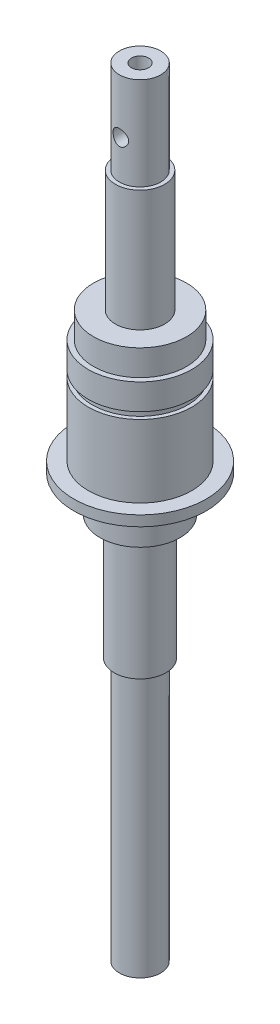
ISO-10303-21;
HEADER;
FILE_DESCRIPTION(('STEP AP214'),'2;1');
FILE_NAME('part.step','',(''),(''),'','','');
FILE_SCHEMA(('AUTOMOTIVE_DESIGN { 1 0 10303 214 1 1 1 1 }'));
ENDSEC;
DATA;
#1=APPLICATION_CONTEXT('core data for automotive mechanical design processes');
#2=APPLICATION_PROTOCOL_DEFINITION('international standard','automotive_design',2000,#1);
#3=PRODUCT_CONTEXT('',#1,'mechanical');
#4=PRODUCT('Part','Part','',(#3));
#5=PRODUCT_RELATED_PRODUCT_CATEGORY('part','',(#4));
#6=PRODUCT_DEFINITION_FORMATION('','',#4);
#7=PRODUCT_DEFINITION_CONTEXT('part definition',#1,'design');
#8=PRODUCT_DEFINITION('design','',#6,#7);
#9=PRODUCT_DEFINITION_SHAPE('','',#8);
#10=(LENGTH_UNIT() NAMED_UNIT(*) SI_UNIT(.MILLI.,.METRE.));
#11=(NAMED_UNIT(*) PLANE_ANGLE_UNIT() SI_UNIT($,.RADIAN.));
#12=(NAMED_UNIT(*) SI_UNIT($,.STERADIAN.) SOLID_ANGLE_UNIT());
#13=UNCERTAINTY_MEASURE_WITH_UNIT(LENGTH_MEASURE(1.E-05),#10,'distance_accuracy_value','');
#14=(GEOMETRIC_REPRESENTATION_CONTEXT(3) GLOBAL_UNCERTAINTY_ASSIGNED_CONTEXT((#13)) GLOBAL_UNIT_ASSIGNED_CONTEXT((#10,
#11,#12)) REPRESENTATION_CONTEXT('',''));
#15=CARTESIAN_POINT('',(0.,0.,0.));
#16=DIRECTION('',(0.,0.,1.));
#17=DIRECTION('',(1.,0.,0.));
#18=AXIS2_PLACEMENT_3D('',#15,#16,#17);
#19=CARTESIAN_POINT('',(0.,110.990908366985,0.));
#20=DIRECTION('',(0.,-1.,0.));
#21=DIRECTION('',(0.,0.,-1.));
#22=AXIS2_PLACEMENT_3D('',#19,#20,#21);
#23=CYLINDRICAL_SURFACE('',#22,4.);
#24=CARTESIAN_POINT('',(0.,90.67720004,-4.));
#25=CARTESIAN_POINT('',(0.0812350589378534,90.6772029423031,-4.00000217456151));
#26=CARTESIAN_POINT('',(0.162450241781793,90.6705802797516,-3.99750379283184));
#27=CARTESIAN_POINT('',(0.322453452352362,90.64437184473,-3.98778696006928));
#28=CARTESIAN_POINT('',(0.401241827987616,90.6247879395294,-3.98056918893993));
#29=CARTESIAN_POINT('',(0.55406078499088,90.5734470382282,-3.96218832391545));
#30=CARTESIAN_POINT('',(0.628100224162279,90.5417135231782,-3.9510328434944));
#31=CARTESIAN_POINT('',(0.769799310160251,90.4670936269842,-3.92588767765353));
#32=CARTESIAN_POINT('',(0.837457239177873,90.4242042544558,-3.91189723227548));
#33=CARTESIAN_POINT('',(0.96734641704582,90.3265875089291,-3.88186246971216));
#34=CARTESIAN_POINT('',(1.02927073015119,90.2714697777406,-3.86576002583566));
#35=CARTESIAN_POINT('',(1.14324421474363,90.1517896053411,-3.83360220871327));
#36=CARTESIAN_POINT('',(1.19529036359202,90.0872242839121,-3.81754685135034));
#37=CARTESIAN_POINT('',(1.28998202215984,89.9474825724768,-3.78662470617732));
#38=CARTESIAN_POINT('',(1.33219393195759,89.8719956734542,-3.77182648820819));
#39=CARTESIAN_POINT('',(1.40318646334084,89.7143516858315,-3.74599860237433));
#40=CARTESIAN_POINT('',(1.43197244961239,89.6321972768449,-3.73496742975881));
#41=CARTESIAN_POINT('',(1.47408431017549,89.4670832997418,-3.71854412824136));
#42=CARTESIAN_POINT('',(1.48799593218557,89.3842950015646,-3.71293924350838));
#43=CARTESIAN_POINT('',(1.50179556531648,89.2173838820061,-3.70738061461215));
#44=CARTESIAN_POINT('',(1.5016893680263,89.1332616261255,-3.70742453659305));
#45=CARTESIAN_POINT('',(1.48790429610018,88.971430514787,-3.71297511632055));
#46=CARTESIAN_POINT('',(1.47503808509003,88.8936391339558,-3.71815468871122));
#47=CARTESIAN_POINT('',(1.4374416786833,88.7414128895947,-3.7328493805953));
#48=CARTESIAN_POINT('',(1.41270969663258,88.6669785333861,-3.74236515298863));
#49=CARTESIAN_POINT('',(1.35163748571904,88.5219229722718,-3.76485702190253));
#50=CARTESIAN_POINT('',(1.315086487371,88.4514005538787,-3.77789517988166));
#51=CARTESIAN_POINT('',(1.23156073762698,88.317254302409,-3.80594210139319));
#52=CARTESIAN_POINT('',(1.18458238728897,88.2536328624803,-3.82095154457158));
#53=CARTESIAN_POINT('',(1.07781780766549,88.1305963763491,-3.85248038859114));
#54=CARTESIAN_POINT('',(1.01738298716956,88.0717513992519,-3.86903347455671));
#55=CARTESIAN_POINT('',(0.887312590819024,87.9648620737942,-3.90091728164085));
#56=CARTESIAN_POINT('',(0.817675603497369,87.9168193853943,-3.91624781465951));
#57=CARTESIAN_POINT('',(0.669723436992427,87.8322696429375,-3.94426394809079));
#58=CARTESIAN_POINT('',(0.591290713844726,87.7959524587789,-3.95690498259616));
#59=CARTESIAN_POINT('',(0.428836850524589,87.73721743573,-3.97778718326962));
#60=CARTESIAN_POINT('',(0.344818210845773,87.7147934234389,-3.98603030341494));
#61=CARTESIAN_POINT('',(0.178375243148671,87.6855772524581,-3.99684443228066));
#62=CARTESIAN_POINT('',(0.0961036195622165,87.6780174336175,-3.99969369025687));
#63=CARTESIAN_POINT('',(-0.0685724752550155,87.6765089761001,-4.00025893700125));
#64=CARTESIAN_POINT('',(-0.150976912983363,87.6825573196832,-3.99797606386863));
#65=CARTESIAN_POINT('',(-0.310262048561848,87.7075100823087,-3.98871709772643));
#66=CARTESIAN_POINT('',(-0.387233328007324,87.7259115837371,-3.98192470962305));
#67=CARTESIAN_POINT('',(-0.536941754957206,87.7743861125473,-3.96451477091717));
#68=CARTESIAN_POINT('',(-0.609678350347519,87.804460657948,-3.9538967228203));
#69=CARTESIAN_POINT('',(-0.751247765110141,87.8763864524395,-3.92949624407681));
#70=CARTESIAN_POINT('',(-0.819903083557782,87.9185577692234,-3.91563000209349));
#71=CARTESIAN_POINT('',(-0.949392711726614,88.0131181431715,-3.88626671564664));
#72=CARTESIAN_POINT('',(-1.01022412027044,88.0655109725451,-3.87076907009516));
#73=CARTESIAN_POINT('',(-1.12603079874453,88.1826041621242,-3.83873329490989));
#74=CARTESIAN_POINT('',(-1.18046154123567,88.2478422227727,-3.8221869650373));
#75=CARTESIAN_POINT('',(-1.27771050031901,88.3868514247076,-3.79078815746855));
#76=CARTESIAN_POINT('',(-1.32052767414516,88.4606233313885,-3.775935831944));
#77=CARTESIAN_POINT('',(-1.39337773518996,88.6152160267723,-3.74966829822464));
#78=CARTESIAN_POINT('',(-1.42335685446916,88.6960647859104,-3.73826760328495));
#79=CARTESIAN_POINT('',(-1.46907883466887,88.8622098036878,-3.72054032891006));
#80=CARTESIAN_POINT('',(-1.48483050305533,88.9475032761981,-3.71421061057491));
#81=CARTESIAN_POINT('',(-1.50086347097837,89.1142161995411,-3.70775894792573));
#82=CARTESIAN_POINT('',(-1.50207331495836,89.1955326717169,-3.70726444523342));
#83=CARTESIAN_POINT('',(-1.49136715641591,89.3571453562761,-3.71158412745293));
#84=CARTESIAN_POINT('',(-1.47945239850122,89.4374416646716,-3.71639780898899));
#85=CARTESIAN_POINT('',(-1.4435581563024,89.5922472667165,-3.73048141585433));
#86=CARTESIAN_POINT('',(-1.41995798316522,89.6668583862453,-3.73961085376664));
#87=CARTESIAN_POINT('',(-1.36169696779918,89.8111055484944,-3.76121548297845));
#88=CARTESIAN_POINT('',(-1.32703332944943,89.8807403280701,-3.77369151995215));
#89=CARTESIAN_POINT('',(-1.24552075938153,90.0170268296976,-3.80139723903964));
#90=CARTESIAN_POINT('',(-1.19812832803009,90.0833308367999,-3.81673698440964));
#91=CARTESIAN_POINT('',(-1.09334485729905,90.2073416009712,-3.84806246757178));
#92=CARTESIAN_POINT('',(-1.03595064012807,90.2650456147867,-3.86404840943145));
#93=CARTESIAN_POINT('',(-0.909080396784608,90.3734019958218,-3.89590424609881));
#94=CARTESIAN_POINT('',(-0.839118644212979,90.4235037934346,-3.91172104900645));
#95=CARTESIAN_POINT('',(-0.691213223200808,90.5112226952765,-3.94054514457031));
#96=CARTESIAN_POINT('',(-0.613268934090609,90.5488388277363,-3.95355221851559));
#97=CARTESIAN_POINT('',(-0.447999082002302,90.6115768690483,-3.97574292606679));
#98=CARTESIAN_POINT('',(-0.360413422234202,90.6360871046019,-3.98473657158356));
#99=CARTESIAN_POINT('',(-0.18187573360638,90.6688929999207,-3.99686242179587));
#100=CARTESIAN_POINT('',(-0.0909254163648579,90.6771967914873,-3.99999756603967));
#101=CARTESIAN_POINT('',(0.,90.67720004,-4.));
#102=B_SPLINE_CURVE_WITH_KNOTS('',3,(#24,#25,#26,#27,#28,#29,#30,#31,#32,#33,#34,#35,#36,#37,
#38,#39,#40,#41,#42,#43,#44,#45,#46,#47,#48,#49,#50,#51,#52,#53,#54,#55,#56,#57,#58,#59,#60,#61,
#62,#63,#64,#65,#66,#67,#68,#69,#70,#71,#72,#73,#74,#75,#76,#77,#78,#79,#80,#81,#82,#83,#84,#85,
#86,#87,#88,#89,#90,#91,#92,#93,#94,#95,#96,#97,#98,#99,#100,#101),.UNSPECIFIED.,.T.,.F.,(4,2,2,
2,2,2,2,2,2,2,2,2,2,2,2,2,2,2,2,2,2,2,2,2,2,2,2,2,2,2,2,2,2,2,2,2,2,2,4),(0.,0.24336980156056,
0.486704549530461,0.729571369213578,0.972503379609483,1.22473618582715,1.47704604925621,
1.73896674501657,2.00078269352132,2.25185874416899,2.50283106079706,2.73878345119969,
2.97477138060587,3.21522408387016,3.45575990744256,3.71246153335811,3.96920257905063,
4.22991375286072,4.49050899698843,4.73725019635922,4.98393668390517,5.22114437923836,
5.4583829325445,5.70259221859596,5.94689180019863,6.20536519455653,6.46386178920135,
6.72343066727199,6.98283874956501,7.22558763480246,7.46831350211254,7.70363142426528,
7.93900886656501,8.18672471884265,8.43451941997056,8.69572329654034,8.95694749805096,
9.22948515032035,9.5018860179612),.UNSPECIFIED.);
#103=CARTESIAN_POINT('',(0.,90.67720004,-4.));
#104=VERTEX_POINT('',#103);
#105=EDGE_CURVE('E52',#104,#104,#102,.T.);
#106=ORIENTED_EDGE('',*,*,#105,.F.);
#107=EDGE_LOOP('',(#106));
#108=FACE_BOUND('',#107,.T.);
#109=CARTESIAN_POINT('',(1.49999999999999,89.17720004,3.70809924354783));
#110=CARTESIAN_POINT('',(1.50000304106109,89.2582075237208,3.70809640633806));
#111=CARTESIAN_POINT('',(1.49341597549487,89.3391949625036,3.71078260240986));
#112=CARTESIAN_POINT('',(1.46736187895468,89.4987281229132,3.72116159304967));
#113=CARTESIAN_POINT('',(1.44789523373263,89.577273917595,3.72885423767112));
#114=CARTESIAN_POINT('',(1.39689657610573,89.7295754116135,3.748254802809));
#115=CARTESIAN_POINT('',(1.36539347266348,89.8033420966511,3.7599530956926));
#116=CARTESIAN_POINT('',(1.29131856742698,89.9445719368188,3.78603134206598));
#117=CARTESIAN_POINT('',(1.24874344095038,90.0120331902825,3.80041210067323));
#118=CARTESIAN_POINT('',(1.15146661374162,90.1420903516228,3.83103574665712));
#119=CARTESIAN_POINT('',(1.09630381213307,90.2043285696294,3.84733341923603));
#120=CARTESIAN_POINT('',(0.976395839778934,90.3189228546715,3.87949750628547));
#121=CARTESIAN_POINT('',(0.911648630256684,90.3712768137418,3.89536382814785));
#122=CARTESIAN_POINT('',(0.771694655177601,90.4663395522956,3.92552873936553));
#123=CARTESIAN_POINT('',(0.696206947538028,90.5086595147158,3.93975561223506));
#124=CARTESIAN_POINT('',(0.538555771965247,90.5798512125249,3.96438007973847));
#125=CARTESIAN_POINT('',(0.456394630933535,90.608727611992,3.97477900217006));
#126=CARTESIAN_POINT('',(0.291489341676831,90.6509579357746,3.99018697103439));
#127=CARTESIAN_POINT('',(0.208923197281597,90.6649276674404,3.99540915214774));
#128=CARTESIAN_POINT('',(0.0424643637947898,90.678921240945,4.0006401410794));
#129=CARTESIAN_POINT('',(-0.0414278850628275,90.6789496176187,4.00065064414902));
#130=CARTESIAN_POINT('',(-0.203743543064469,90.6654182785348,3.99559265903895));
#131=CARTESIAN_POINT('',(-0.282232178266893,90.6525307420512,3.99077541996683));
#132=CARTESIAN_POINT('',(-0.435839217984382,90.6146641247744,3.97693274932263));
#133=CARTESIAN_POINT('',(-0.510957383430286,90.5896841877379,3.96790701975577));
#134=CARTESIAN_POINT('',(-0.656989017303092,90.5280295883241,3.9463776916753));
#135=CARTESIAN_POINT('',(-0.7278253922873,90.4911900347316,3.93382539470077));
#136=CARTESIAN_POINT('',(-0.862486607957549,90.4070079430706,3.9065131022528));
#137=CARTESIAN_POINT('',(-0.926309176932308,90.3596620169824,3.89175239512841));
#138=CARTESIAN_POINT('',(-1.04909048680092,90.2525727537168,3.86052529655817));
#139=CARTESIAN_POINT('',(-1.10754614526347,90.1922661243496,3.84400963763883));
#140=CARTESIAN_POINT('',(-1.21370395569341,90.0626070466784,3.81182460645722));
#141=CARTESIAN_POINT('',(-1.26140340692898,89.9932523334133,3.79615544748847));
#142=CARTESIAN_POINT('',(-1.34565611808149,89.8454805725372,3.76712703500336));
#143=CARTESIAN_POINT('',(-1.38193847851829,89.7668965463139,3.75382677150277));
#144=CARTESIAN_POINT('',(-1.44056464441499,89.6041038148324,3.73172438629003));
#145=CARTESIAN_POINT('',(-1.46291620605593,89.5198982684063,3.72291976205783));
#146=CARTESIAN_POINT('',(-1.49190191709666,89.353224077684,3.71139597222848));
#147=CARTESIAN_POINT('',(-1.49933521158964,89.2709159344638,3.70836785241537));
#148=CARTESIAN_POINT('',(-1.5005788563627,89.1061906832582,3.70786539525017));
#149=CARTESIAN_POINT('',(-1.4943926109376,89.0237736076475,3.71038967003988));
#150=CARTESIAN_POINT('',(-1.46929733520155,88.8652701177123,3.72039381629736));
#151=CARTESIAN_POINT('',(-1.45100618334223,88.7890689042353,3.72763276216449));
#152=CARTESIAN_POINT('',(-1.40299774640636,88.6408520952798,3.74596487046362));
#153=CARTESIAN_POINT('',(-1.37327812034621,88.5688373608318,3.75705882250174));
#154=CARTESIAN_POINT('',(-1.30200292275276,88.4280356019238,3.78236243116081));
#155=CARTESIAN_POINT('',(-1.26004545177045,88.3594707478626,3.79667328892066));
#156=CARTESIAN_POINT('',(-1.16591317862477,88.2300710582739,3.82662814294292));
#157=CARTESIAN_POINT('',(-1.11373463696433,88.1692390653754,3.84227262594077));
#158=CARTESIAN_POINT('',(-0.996727340900916,88.0530316668049,3.87433046553184));
#159=CARTESIAN_POINT('',(-0.931306341491038,87.9982466312312,3.89072969357028));
#160=CARTESIAN_POINT('',(-0.791797471753129,87.9003616724105,3.92149874963303));
#161=CARTESIAN_POINT('',(-0.717709573322656,87.8572617870542,3.93586857107665));
#162=CARTESIAN_POINT('',(-0.563016329468462,87.7842539838004,3.96094985704552));
#163=CARTESIAN_POINT('',(-0.48243443306461,87.7543009162074,3.9716738133801));
#164=CARTESIAN_POINT('',(-0.316881887523239,87.7085436261501,3.98829436712571));
#165=CARTESIAN_POINT('',(-0.231913320723581,87.6927327545776,3.99419323299412));
#166=CARTESIAN_POINT('',(-0.065335585273807,87.6764256372452,4.00028407317073));
#167=CARTESIAN_POINT('',(0.0161807680608536,87.675090556941,4.00078860953764));
#168=CARTESIAN_POINT('',(0.178226786412431,87.6856151994454,3.99684889809224));
#169=CARTESIAN_POINT('',(0.258756569245264,87.6974733308859,3.9924052471313));
#170=CARTESIAN_POINT('',(0.41454824837713,87.7334588914936,3.97921089603771));
#171=CARTESIAN_POINT('',(0.489890731068836,87.7572799458784,3.97056791378017));
#172=CARTESIAN_POINT('',(0.63551547300639,87.8162100533844,3.9498778362099));
#173=CARTESIAN_POINT('',(0.705796771275543,87.8513212433048,3.93783009655664));
#174=CARTESIAN_POINT('',(0.842540176994415,87.9335139835048,3.91090618300074));
#175=CARTESIAN_POINT('',(0.908717548846852,87.9810366805141,3.89593240108828));
#176=CARTESIAN_POINT('',(1.03241734752336,88.0860078701876,3.86499507694844));
#177=CARTESIAN_POINT('',(1.0899366712559,88.1434599058079,3.84903118274026));
#178=CARTESIAN_POINT('',(1.19781214236196,88.2702641716451,3.81688129739175));
#179=CARTESIAN_POINT('',(1.24762999816025,88.3400844421543,3.8007280534916));
#180=CARTESIAN_POINT('',(1.33484709556843,88.4876159095733,3.77098325003638));
#181=CARTESIAN_POINT('',(1.37224504878157,88.5653279240535,3.75739195631217));
#182=CARTESIAN_POINT('',(1.4346588697426,88.7301557209754,3.73402269853267));
#183=CARTESIAN_POINT('',(1.45906002899522,88.8175344065118,3.7244380329086));
#184=CARTESIAN_POINT('',(1.49172356722079,88.9956853119558,3.71147994336315));
#185=CARTESIAN_POINT('',(1.4999965933957,89.08645525271,3.70810242179736));
#186=CARTESIAN_POINT('',(1.49999999999999,89.17720004,3.70809924354783));
#187=B_SPLINE_CURVE_WITH_KNOTS('',3,(#109,#110,#111,#112,#113,#114,#115,#116,#117,#118,#119,
#120,#121,#122,#123,#124,#125,#126,#127,#128,#129,#130,#131,#132,#133,#134,#135,#136,#137,#138,
#139,#140,#141,#142,#143,#144,#145,#146,#147,#148,#149,#150,#151,#152,#153,#154,#155,#156,#157,
#158,#159,#160,#161,#162,#163,#164,#165,#166,#167,#168,#169,#170,#171,#172,#173,#174,#175,#176,
#177,#178,#179,#180,#181,#182,#183,#184,#185,#186),.UNSPECIFIED.,.T.,.F.,(4,2,2,2,2,2,2,2,2,2,2,
2,2,2,2,2,2,2,2,2,2,2,2,2,2,2,2,2,2,2,2,2,2,2,2,2,2,2,4),(0.,0.242684541416157,
0.485361814598855,0.727459856757023,0.969630679682928,1.22274652401126,1.47591628822981,
1.7377007213642,1.99939426381329,2.24980018489678,2.50012465404855,2.73806472803193,
2.97602165263334,3.21744131210666,3.45893893628974,3.71456675065872,3.97025867827332,
4.23162592252962,4.49284751635471,4.73965657740481,4.9864039538888,5.22143845928195,
5.45652113429523,5.70041561005818,5.94439948466351,6.20385016993621,6.46330169650174,
6.72185508890164,6.98028685560122,7.22365720549931,7.46699820319474,7.70440274003885,
7.94185223512825,8.18928323676981,8.43680270894958,8.69738599542073,8.95799630544236,
9.23003178870917,9.50188762323046),.UNSPECIFIED.);
#188=CARTESIAN_POINT('',(1.49999999999999,89.17720004,3.70809924354783));
#189=VERTEX_POINT('',#188);
#190=EDGE_CURVE('E12',#189,#189,#187,.T.);
#191=ORIENTED_EDGE('',*,*,#190,.F.);
#192=EDGE_LOOP('',(#191));
#193=FACE_BOUND('',#192,.T.);
#194=CARTESIAN_POINT('',(0.,99.677199868,0.));
#195=DIRECTION('',(0.,-1.,0.));
#196=DIRECTION('',(0.,0.,-1.));
#197=AXIS2_PLACEMENT_3D('',#194,#195,#196);
#198=CIRCLE('',#197,4.);
#199=CARTESIAN_POINT('',(0.,99.677199868,-4.));
#200=VERTEX_POINT('',#199);
#201=EDGE_CURVE('E59',#200,#200,#198,.F.);
#202=ORIENTED_EDGE('',*,*,#201,.F.);
#203=EDGE_LOOP('',(#202));
#204=FACE_BOUND('',#203,.T.);
#205=CARTESIAN_POINT('',(0.,81.7122,0.));
#206=DIRECTION('',(0.,-1.,0.));
#207=DIRECTION('',(0.,0.,-1.));
#208=AXIS2_PLACEMENT_3D('',#205,#206,#207);
#209=CIRCLE('',#208,4.);
#210=CARTESIAN_POINT('',(0.,81.7122,-4.));
#211=VERTEX_POINT('',#210);
#212=EDGE_CURVE('E75',#211,#211,#209,.T.);
#213=ORIENTED_EDGE('',*,*,#212,.F.);
#214=EDGE_LOOP('',(#213));
#215=FACE_BOUND('',#214,.T.);
#216=ADVANCED_FACE('F48',(#108,#193,#204,#215),#23,.T.);
#217=CARTESIAN_POINT('',(0.,81.7122,0.));
#218=DIRECTION('',(0.,-1.,0.));
#219=DIRECTION('',(0.,0.,-1.));
#220=AXIS2_PLACEMENT_3D('',#217,#218,#219);
#221=PLANE('',#220);
#222=ORIENTED_EDGE('',*,*,#212,.T.);
#223=EDGE_LOOP('',(#222));
#224=FACE_BOUND('',#223,.T.);
#225=ADVANCED_FACE('F92',(#224),#221,.T.);
#226=CARTESIAN_POINT('',(0.,99.677199868,0.));
#227=DIRECTION('',(0.,-1.,0.));
#228=DIRECTION('',(1.,0.,0.));
#229=AXIS2_PLACEMENT_3D('',#226,#227,#228);
#230=PLANE('',#229);
#231=CARTESIAN_POINT('',(0.,99.677199868,0.));
#232=DIRECTION('',(0.,1.,0.));
#233=DIRECTION('',(0.,0.,1.));
#234=AXIS2_PLACEMENT_3D('',#231,#232,#233);
#235=CIRCLE('',#234,1.64999999999999);
#236=CARTESIAN_POINT('',(0.,99.677199868,1.64999999999999));
#237=VERTEX_POINT('',#236);
#238=EDGE_CURVE('E72',#237,#237,#235,.T.);
#239=ORIENTED_EDGE('',*,*,#238,.F.);
#240=EDGE_LOOP('',(#239));
#241=FACE_BOUND('',#240,.T.);
#242=ORIENTED_EDGE('',*,*,#201,.T.);
#243=EDGE_LOOP('',(#242));
#244=FACE_BOUND('',#243,.T.);
#245=ADVANCED_FACE('F87',(#241,#244),#230,.F.);
#246=CARTESIAN_POINT('',(0.,89.17720004,4.));
#247=DIRECTION('',(0.,0.,1.));
#248=DIRECTION('',(1.,0.,0.));
#249=AXIS2_PLACEMENT_3D('',#246,#247,#248);
#250=CYLINDRICAL_SURFACE('',#249,1.49999999999999);
#251=ORIENTED_EDGE('',*,*,#105,.T.);
#252=EDGE_LOOP('',(#251));
#253=FACE_BOUND('',#252,.T.);
#254=ORIENTED_EDGE('',*,*,#190,.T.);
#255=EDGE_LOOP('',(#254));
#256=FACE_BOUND('',#255,.T.);
#257=ADVANCED_FACE('F66',(#253,#256),#250,.F.);
#258=CARTESIAN_POINT('',(0.,92.565199868,0.));
#259=DIRECTION('',(0.,1.,0.));
#260=DIRECTION('',(0.,0.,1.));
#261=AXIS2_PLACEMENT_3D('',#258,#259,#260);
#262=CONICAL_SURFACE('',#261,1.65,1.02974425867665);
#263=CARTESIAN_POINT('',(0.,91.5737798466045,0.));
#264=VERTEX_POINT('',#263);
#265=VERTEX_LOOP('',#264);
#266=FACE_BOUND('',#265,.T.);
#267=CARTESIAN_POINT('',(0.,92.565199868,0.));
#268=DIRECTION('',(0.,1.,0.));
#269=DIRECTION('',(0.,0.,1.));
#270=AXIS2_PLACEMENT_3D('',#267,#268,#269);
#271=CIRCLE('',#270,1.65);
#272=CARTESIAN_POINT('',(0.,92.565199868,1.65));
#273=VERTEX_POINT('',#272);
#274=EDGE_CURVE('E70',#273,#273,#271,.T.);
#275=ORIENTED_EDGE('',*,*,#274,.T.);
#276=EDGE_LOOP('',(#275));
#277=FACE_BOUND('',#276,.T.);
#278=ADVANCED_FACE('F62',(#266,#277),#262,.F.);
#279=CARTESIAN_POINT('',(0.,99.677199868,0.));
#280=DIRECTION('',(0.,1.,0.));
#281=DIRECTION('',(0.,0.,1.));
#282=AXIS2_PLACEMENT_3D('',#279,#280,#281);
#283=CYLINDRICAL_SURFACE('',#282,1.64999999999999);
#284=ORIENTED_EDGE('',*,*,#274,.F.);
#285=EDGE_LOOP('',(#284));
#286=FACE_BOUND('',#285,.T.);
#287=ORIENTED_EDGE('',*,*,#238,.T.);
#288=EDGE_LOOP('',(#287));
#289=FACE_BOUND('',#288,.T.);
#290=ADVANCED_FACE('F65',(#286,#289),#283,.F.);
#291=CLOSED_SHELL('',(#216,#225,#245,#257,#278,#290));
#292=MANIFOLD_SOLID_BREP('B2',#291);
#293=CARTESIAN_POINT('',(0.,58.3,0.));
#294=DIRECTION('',(0.,-1.,0.));
#295=DIRECTION('',(0.,0.,-1.));
#296=AXIS2_PLACEMENT_3D('',#293,#294,#295);
#297=PLANE('',#296);
#298=CARTESIAN_POINT('',(0.,58.3,0.));
#299=DIRECTION('',(0.,-1.,0.));
#300=DIRECTION('',(0.,0.,-1.));
#301=AXIS2_PLACEMENT_3D('',#298,#299,#300);
#302=CIRCLE('',#301,4.7625);
#303=CARTESIAN_POINT('',(0.,58.3,-4.7625));
#304=VERTEX_POINT('',#303);
#305=EDGE_CURVE('E47',#304,#304,#302,.F.);
#306=ORIENTED_EDGE('',*,*,#305,.F.);
#307=EDGE_LOOP('',(#306));
#308=FACE_BOUND('',#307,.T.);
#309=ADVANCED_FACE('F158',(#308),#297,.T.);
#310=CARTESIAN_POINT('',(0.,81.7122,0.));
#311=DIRECTION('',(0.,1.,0.));
#312=DIRECTION('',(0.,0.,1.));
#313=AXIS2_PLACEMENT_3D('',#310,#311,#312);
#314=PLANE('',#313);
#315=CARTESIAN_POINT('',(0.,81.7122,0.));
#316=DIRECTION('',(0.,1.,0.));
#317=DIRECTION('',(0.,0.,1.));
#318=AXIS2_PLACEMENT_3D('',#315,#316,#317);
#319=CIRCLE('',#318,4.7625);
#320=CARTESIAN_POINT('',(0.,81.7122,4.7625));
#321=VERTEX_POINT('',#320);
#322=EDGE_CURVE('E164',#321,#321,#319,.T.);
#323=ORIENTED_EDGE('',*,*,#322,.T.);
#324=EDGE_LOOP('',(#323));
#325=FACE_BOUND('',#324,.T.);
#326=ADVANCED_FACE('F170',(#325),#314,.T.);
#327=CARTESIAN_POINT('',(0.,44.8296158183963,0.));
#328=DIRECTION('',(0.,1.,0.));
#329=DIRECTION('',(0.,0.,1.));
#330=AXIS2_PLACEMENT_3D('',#327,#328,#329);
#331=CYLINDRICAL_SURFACE('',#330,4.7625);
#332=ORIENTED_EDGE('',*,*,#322,.F.);
#333=EDGE_LOOP('',(#332));
#334=FACE_BOUND('',#333,.T.);
#335=ORIENTED_EDGE('',*,*,#305,.T.);
#336=EDGE_LOOP('',(#335));
#337=FACE_BOUND('',#336,.T.);
#338=ADVANCED_FACE('F172',(#334,#337),#331,.T.);
#339=CLOSED_SHELL('',(#309,#326,#338));
#340=MANIFOLD_SOLID_BREP('B6',#339);
#341=CARTESIAN_POINT('',(0.,4.71572875253808,0.));
#342=DIRECTION('',(0.,1.,0.));
#343=DIRECTION('',(0.,0.,1.));
#344=AXIS2_PLACEMENT_3D('',#341,#342,#343);
#345=CYLINDRICAL_SURFACE('',#344,10.);
#346=CARTESIAN_POINT('',(0.,33.,0.));
#347=DIRECTION('',(0.,1.,0.));
#348=DIRECTION('',(0.,0.,1.));
#349=AXIS2_PLACEMENT_3D('',#346,#347,#348);
#350=CIRCLE('',#349,10.);
#351=CARTESIAN_POINT('',(0.,33.,10.));
#352=VERTEX_POINT('',#351);
#353=EDGE_CURVE('E157',#352,#352,#350,.F.);
#354=ORIENTED_EDGE('',*,*,#353,.F.);
#355=EDGE_LOOP('',(#354));
#356=FACE_BOUND('',#355,.T.);
#357=CARTESIAN_POINT('',(0.,47.,0.));
#358=DIRECTION('',(0.,1.,0.));
#359=DIRECTION('',(0.,0.,1.));
#360=AXIS2_PLACEMENT_3D('',#357,#358,#359);
#361=CIRCLE('',#360,10.);
#362=CARTESIAN_POINT('',(0.,47.,10.));
#363=VERTEX_POINT('',#362);
#364=EDGE_CURVE('E212',#363,#363,#361,.T.);
#365=ORIENTED_EDGE('',*,*,#364,.F.);
#366=EDGE_LOOP('',(#365));
#367=FACE_BOUND('',#366,.T.);
#368=ADVANCED_FACE('F206',(#356,#367),#345,.T.);
#369=CARTESIAN_POINT('',(0.,47.,0.));
#370=DIRECTION('',(0.,1.,0.));
#371=DIRECTION('',(0.,0.,1.));
#372=AXIS2_PLACEMENT_3D('',#369,#370,#371);
#373=PLANE('',#372);
#374=CARTESIAN_POINT('',(0.,47.,0.));
#375=DIRECTION('',(0.,1.,0.));
#376=DIRECTION('',(0.,0.,1.));
#377=AXIS2_PLACEMENT_3D('',#374,#375,#376);
#378=CIRCLE('',#377,9.25);
#379=CARTESIAN_POINT('',(0.,47.,9.25));
#380=VERTEX_POINT('',#379);
#381=EDGE_CURVE('E228',#380,#380,#378,.T.);
#382=ORIENTED_EDGE('',*,*,#381,.F.);
#383=EDGE_LOOP('',(#382));
#384=FACE_BOUND('',#383,.T.);
#385=ORIENTED_EDGE('',*,*,#364,.T.);
#386=EDGE_LOOP('',(#385));
#387=FACE_BOUND('',#386,.T.);
#388=ADVANCED_FACE('F263',(#384,#387),#373,.T.);
#389=CARTESIAN_POINT('',(0.,-5.20386719675123,0.));
#390=DIRECTION('',(0.,1.,0.));
#391=DIRECTION('',(0.,0.,1.));
#392=AXIS2_PLACEMENT_3D('',#389,#390,#391);
#393=CYLINDRICAL_SURFACE('',#392,12.8);
#394=CARTESIAN_POINT('',(0.,33.,0.));
#395=DIRECTION('',(0.,-1.,0.));
#396=DIRECTION('',(0.,0.,-1.));
#397=AXIS2_PLACEMENT_3D('',#394,#395,#396);
#398=CIRCLE('',#397,12.8);
#399=CARTESIAN_POINT('',(0.,33.,-12.8));
#400=VERTEX_POINT('',#399);
#401=EDGE_CURVE('E220',#400,#400,#398,.T.);
#402=ORIENTED_EDGE('',*,*,#401,.T.);
#403=EDGE_LOOP('',(#402));
#404=FACE_BOUND('',#403,.T.);
#405=CARTESIAN_POINT('',(0.,31.,0.));
#406=DIRECTION('',(0.,-1.,0.));
#407=DIRECTION('',(0.,0.,-1.));
#408=AXIS2_PLACEMENT_3D('',#405,#406,#407);
#409=CIRCLE('',#408,12.8);
#410=CARTESIAN_POINT('',(0.,31.,-12.8));
#411=VERTEX_POINT('',#410);
#412=EDGE_CURVE('E216',#411,#411,#409,.T.);
#413=ORIENTED_EDGE('',*,*,#412,.F.);
#414=EDGE_LOOP('',(#413));
#415=FACE_BOUND('',#414,.T.);
#416=ADVANCED_FACE('F261',(#404,#415),#393,.T.);
#417=CARTESIAN_POINT('',(0.,33.,0.));
#418=DIRECTION('',(0.,-1.,0.));
#419=DIRECTION('',(0.,0.,-1.));
#420=AXIS2_PLACEMENT_3D('',#417,#418,#419);
#421=PLANE('',#420);
#422=ORIENTED_EDGE('',*,*,#353,.T.);
#423=EDGE_LOOP('',(#422));
#424=FACE_BOUND('',#423,.T.);
#425=ORIENTED_EDGE('',*,*,#401,.F.);
#426=EDGE_LOOP('',(#425));
#427=FACE_BOUND('',#426,.T.);
#428=ADVANCED_FACE('F257',(#424,#427),#421,.F.);
#429=CARTESIAN_POINT('',(0.,31.,0.));
#430=DIRECTION('',(0.,-1.,0.));
#431=DIRECTION('',(0.,0.,-1.));
#432=AXIS2_PLACEMENT_3D('',#429,#430,#431);
#433=PLANE('',#432);
#434=CARTESIAN_POINT('',(0.,31.,0.));
#435=DIRECTION('',(0.,-1.,0.));
#436=DIRECTION('',(0.,0.,-1.));
#437=AXIS2_PLACEMENT_3D('',#434,#435,#436);
#438=CIRCLE('',#437,7.75);
#439=CARTESIAN_POINT('',(0.,31.,-7.75));
#440=VERTEX_POINT('',#439);
#441=EDGE_CURVE('E246',#440,#440,#438,.T.);
#442=ORIENTED_EDGE('',*,*,#441,.F.);
#443=EDGE_LOOP('',(#442));
#444=FACE_BOUND('',#443,.T.);
#445=ORIENTED_EDGE('',*,*,#412,.T.);
#446=EDGE_LOOP('',(#445));
#447=FACE_BOUND('',#446,.T.);
#448=ADVANCED_FACE('F253',(#444,#447),#433,.T.);
#449=CARTESIAN_POINT('',(0.,74.4629509039023,0.));
#450=DIRECTION('',(0.,-1.,0.));
#451=DIRECTION('',(0.,0.,-1.));
#452=AXIS2_PLACEMENT_3D('',#449,#450,#451);
#453=CYLINDRICAL_SURFACE('',#452,9.25);
#454=ORIENTED_EDGE('',*,*,#381,.T.);
#455=EDGE_LOOP('',(#454));
#456=FACE_BOUND('',#455,.T.);
#457=CARTESIAN_POINT('',(0.,48.3,0.));
#458=DIRECTION('',(0.,1.,0.));
#459=DIRECTION('',(0.,0.,1.));
#460=AXIS2_PLACEMENT_3D('',#457,#458,#459);
#461=CIRCLE('',#460,9.25);
#462=CARTESIAN_POINT('',(0.,48.3,9.25));
#463=VERTEX_POINT('',#462);
#464=EDGE_CURVE('E225',#463,#463,#461,.T.);
#465=ORIENTED_EDGE('',*,*,#464,.F.);
#466=EDGE_LOOP('',(#465));
#467=FACE_BOUND('',#466,.T.);
#468=ADVANCED_FACE('F256',(#456,#467),#453,.T.);
#469=CARTESIAN_POINT('',(0.,53.3,0.));
#470=DIRECTION('',(0.,-1.,0.));
#471=DIRECTION('',(0.,0.,-1.));
#472=AXIS2_PLACEMENT_3D('',#469,#470,#471);
#473=CYLINDRICAL_SURFACE('',#472,10.);
#474=CARTESIAN_POINT('',(0.,53.3,0.));
#475=DIRECTION('',(0.,1.,0.));
#476=DIRECTION('',(0.,0.,1.));
#477=AXIS2_PLACEMENT_3D('',#474,#475,#476);
#478=CIRCLE('',#477,10.);
#479=CARTESIAN_POINT('',(0.,53.3,10.));
#480=VERTEX_POINT('',#479);
#481=EDGE_CURVE('E231',#480,#480,#478,.T.);
#482=ORIENTED_EDGE('',*,*,#481,.F.);
#483=EDGE_LOOP('',(#482));
#484=FACE_BOUND('',#483,.T.);
#485=CARTESIAN_POINT('',(0.,48.3,0.));
#486=DIRECTION('',(0.,1.,0.));
#487=DIRECTION('',(0.,0.,1.));
#488=AXIS2_PLACEMENT_3D('',#485,#486,#487);
#489=CIRCLE('',#488,10.);
#490=CARTESIAN_POINT('',(0.,48.3,10.));
#491=VERTEX_POINT('',#490);
#492=EDGE_CURVE('E232',#491,#491,#489,.T.);
#493=ORIENTED_EDGE('',*,*,#492,.T.);
#494=EDGE_LOOP('',(#493));
#495=FACE_BOUND('',#494,.T.);
#496=ADVANCED_FACE('F306',(#484,#495),#473,.T.);
#497=CARTESIAN_POINT('',(0.,53.3,0.));
#498=DIRECTION('',(0.,1.,0.));
#499=DIRECTION('',(0.,0.,1.));
#500=AXIS2_PLACEMENT_3D('',#497,#498,#499);
#501=PLANE('',#500);
#502=CARTESIAN_POINT('',(0.,53.3,0.));
#503=DIRECTION('',(0.,1.,0.));
#504=DIRECTION('',(0.,0.,1.));
#505=AXIS2_PLACEMENT_3D('',#502,#503,#504);
#506=CIRCLE('',#505,9.);
#507=CARTESIAN_POINT('',(0.,53.3,9.));
#508=VERTEX_POINT('',#507);
#509=EDGE_CURVE('E240',#508,#508,#506,.T.);
#510=ORIENTED_EDGE('',*,*,#509,.F.);
#511=EDGE_LOOP('',(#510));
#512=FACE_BOUND('',#511,.T.);
#513=ORIENTED_EDGE('',*,*,#481,.T.);
#514=EDGE_LOOP('',(#513));
#515=FACE_BOUND('',#514,.T.);
#516=ADVANCED_FACE('F316',(#512,#515),#501,.T.);
#517=CARTESIAN_POINT('',(0.,48.3,0.));
#518=DIRECTION('',(0.,1.,0.));
#519=DIRECTION('',(0.,0.,1.));
#520=AXIS2_PLACEMENT_3D('',#517,#518,#519);
#521=PLANE('',#520);
#522=ORIENTED_EDGE('',*,*,#464,.T.);
#523=EDGE_LOOP('',(#522));
#524=FACE_BOUND('',#523,.T.);
#525=ORIENTED_EDGE('',*,*,#492,.F.);
#526=EDGE_LOOP('',(#525));
#527=FACE_BOUND('',#526,.T.);
#528=ADVANCED_FACE('F326',(#524,#527),#521,.F.);
#529=CARTESIAN_POINT('',(0.,83.7558441227157,0.));
#530=DIRECTION('',(0.,-1.,0.));
#531=DIRECTION('',(0.,0.,-1.));
#532=AXIS2_PLACEMENT_3D('',#529,#530,#531);
#533=CYLINDRICAL_SURFACE('',#532,9.);
#534=ORIENTED_EDGE('',*,*,#509,.T.);
#535=EDGE_LOOP('',(#534));
#536=FACE_BOUND('',#535,.T.);
#537=CARTESIAN_POINT('',(0.,58.3,0.));
#538=DIRECTION('',(0.,1.,0.));
#539=DIRECTION('',(0.,0.,1.));
#540=AXIS2_PLACEMENT_3D('',#537,#538,#539);
#541=CIRCLE('',#540,9.);
#542=CARTESIAN_POINT('',(0.,58.3,9.));
#543=VERTEX_POINT('',#542);
#544=EDGE_CURVE('E235',#543,#543,#541,.T.);
#545=ORIENTED_EDGE('',*,*,#544,.F.);
#546=EDGE_LOOP('',(#545));
#547=FACE_BOUND('',#546,.T.);
#548=ADVANCED_FACE('F336',(#536,#547),#533,.T.);
#549=CARTESIAN_POINT('',(0.,58.3,0.));
#550=DIRECTION('',(0.,1.,0.));
#551=DIRECTION('',(0.,0.,1.));
#552=AXIS2_PLACEMENT_3D('',#549,#550,#551);
#553=PLANE('',#552);
#554=ORIENTED_EDGE('',*,*,#544,.T.);
#555=EDGE_LOOP('',(#554));
#556=FACE_BOUND('',#555,.T.);
#557=ADVANCED_FACE('F346',(#556),#553,.T.);
#558=CARTESIAN_POINT('',(0.,2.07968978321703,0.));
#559=DIRECTION('',(0.,1.,0.));
#560=DIRECTION('',(0.,0.,1.));
#561=AXIS2_PLACEMENT_3D('',#558,#559,#560);
#562=CYLINDRICAL_SURFACE('',#561,7.75);
#563=ORIENTED_EDGE('',*,*,#441,.T.);
#564=EDGE_LOOP('',(#563));
#565=FACE_BOUND('',#564,.T.);
#566=CARTESIAN_POINT('',(0.,24.,0.));
#567=DIRECTION('',(0.,-1.,0.));
#568=DIRECTION('',(0.,0.,-1.));
#569=AXIS2_PLACEMENT_3D('',#566,#567,#568);
#570=CIRCLE('',#569,7.75);
#571=CARTESIAN_POINT('',(0.,24.,-7.75));
#572=VERTEX_POINT('',#571);
#573=EDGE_CURVE('E243',#572,#572,#570,.T.);
#574=ORIENTED_EDGE('',*,*,#573,.F.);
#575=EDGE_LOOP('',(#574));
#576=FACE_BOUND('',#575,.T.);
#577=ADVANCED_FACE('F250',(#565,#576),#562,.T.);
#578=CARTESIAN_POINT('',(0.,24.,0.));
#579=DIRECTION('',(0.,-1.,0.));
#580=DIRECTION('',(0.,0.,-1.));
#581=AXIS2_PLACEMENT_3D('',#578,#579,#580);
#582=PLANE('',#581);
#583=ORIENTED_EDGE('',*,*,#573,.T.);
#584=EDGE_LOOP('',(#583));
#585=FACE_BOUND('',#584,.T.);
#586=ADVANCED_FACE('F365',(#585),#582,.T.);
#587=CLOSED_SHELL('',(#368,#388,#416,#428,#448,#468,#496,#516,#528,#548,#557,#577,#586));
#588=MANIFOLD_SOLID_BREP('B42',#587);
#589=CARTESIAN_POINT('',(0.,38.142135623731,0.));
#590=DIRECTION('',(0.,-1.,0.));
#591=DIRECTION('',(0.,0.,-1.));
#592=AXIS2_PLACEMENT_3D('',#589,#590,#591);
#593=CYLINDRICAL_SURFACE('',#592,5.);
#594=CARTESIAN_POINT('',(0.,24.,0.));
#595=DIRECTION('',(0.,-1.,0.));
#596=DIRECTION('',(0.,0.,-1.));
#597=AXIS2_PLACEMENT_3D('',#594,#595,#596);
#598=CIRCLE('',#597,5.);
#599=CARTESIAN_POINT('',(0.,24.,-5.));
#600=VERTEX_POINT('',#599);
#601=EDGE_CURVE('E205',#600,#600,#598,.T.);
#602=ORIENTED_EDGE('',*,*,#601,.T.);
#603=EDGE_LOOP('',(#602));
#604=FACE_BOUND('',#603,.T.);
#605=CARTESIAN_POINT('',(0.,0.,0.));
#606=DIRECTION('',(0.,-1.,0.));
#607=DIRECTION('',(0.,0.,-1.));
#608=AXIS2_PLACEMENT_3D('',#605,#606,#607);
#609=CIRCLE('',#608,5.);
#610=CARTESIAN_POINT('',(0.,0.,-5.));
#611=VERTEX_POINT('',#610);
#612=EDGE_CURVE('E403',#611,#611,#609,.T.);
#613=ORIENTED_EDGE('',*,*,#612,.F.);
#614=EDGE_LOOP('',(#613));
#615=FACE_BOUND('',#614,.T.);
#616=ADVANCED_FACE('F397',(#604,#615),#593,.T.);
#617=CARTESIAN_POINT('',(0.,24.,9.2967032967033));
#618=DIRECTION('',(0.,-1.,0.));
#619=DIRECTION('',(1.,0.,0.));
#620=AXIS2_PLACEMENT_3D('',#617,#618,#619);
#621=PLANE('',#620);
#622=ORIENTED_EDGE('',*,*,#601,.F.);
#623=EDGE_LOOP('',(#622));
#624=FACE_BOUND('',#623,.T.);
#625=ADVANCED_FACE('F421',(#624),#621,.F.);
#626=CARTESIAN_POINT('',(0.,0.,0.));
#627=DIRECTION('',(0.,-1.,0.));
#628=DIRECTION('',(0.,0.,-1.));
#629=AXIS2_PLACEMENT_3D('',#626,#627,#628);
#630=PLANE('',#629);
#631=CARTESIAN_POINT('',(0.,0.,0.));
#632=DIRECTION('',(0.,-1.,0.));
#633=DIRECTION('',(0.,0.,-1.));
#634=AXIS2_PLACEMENT_3D('',#631,#632,#633);
#635=CIRCLE('',#634,4.);
#636=CARTESIAN_POINT('',(0.,0.,-4.));
#637=VERTEX_POINT('',#636);
#638=EDGE_CURVE('E411',#637,#637,#635,.T.);
#639=ORIENTED_EDGE('',*,*,#638,.F.);
#640=EDGE_LOOP('',(#639));
#641=FACE_BOUND('',#640,.T.);
#642=ORIENTED_EDGE('',*,*,#612,.T.);
#643=EDGE_LOOP('',(#642));
#644=FACE_BOUND('',#643,.T.);
#645=ADVANCED_FACE('F419',(#641,#644),#630,.T.);
#646=CARTESIAN_POINT('',(0.,-50.8,0.));
#647=DIRECTION('',(0.,1.,0.));
#648=DIRECTION('',(0.,0.,1.));
#649=AXIS2_PLACEMENT_3D('',#646,#647,#648);
#650=CYLINDRICAL_SURFACE('',#649,4.);
#651=CARTESIAN_POINT('',(0.,-50.8,0.));
#652=DIRECTION('',(0.,-1.,0.));
#653=DIRECTION('',(0.,0.,-1.));
#654=AXIS2_PLACEMENT_3D('',#651,#652,#653);
#655=CIRCLE('',#654,4.);
#656=CARTESIAN_POINT('',(0.,-50.8,-4.));
#657=VERTEX_POINT('',#656);
#658=EDGE_CURVE('E407',#657,#657,#655,.T.);
#659=ORIENTED_EDGE('',*,*,#658,.F.);
#660=EDGE_LOOP('',(#659));
#661=FACE_BOUND('',#660,.T.);
#662=ORIENTED_EDGE('',*,*,#638,.T.);
#663=EDGE_LOOP('',(#662));
#664=FACE_BOUND('',#663,.T.);
#665=ADVANCED_FACE('F417',(#661,#664),#650,.T.);
#666=CARTESIAN_POINT('',(0.,-50.8,0.));
#667=DIRECTION('',(0.,-1.,0.));
#668=DIRECTION('',(0.,0.,-1.));
#669=AXIS2_PLACEMENT_3D('',#666,#667,#668);
#670=PLANE('',#669);
#671=ORIENTED_EDGE('',*,*,#658,.T.);
#672=EDGE_LOOP('',(#671));
#673=FACE_BOUND('',#672,.T.);
#674=ADVANCED_FACE('F427',(#673),#670,.T.);
#675=CLOSED_SHELL('',(#616,#625,#645,#665,#674));
#676=MANIFOLD_SOLID_BREP('B152',#675);
#677=ADVANCED_BREP_SHAPE_REPRESENTATION('',(#18,#292,#340,#588,#676),#14);
#678=SHAPE_DEFINITION_REPRESENTATION(#9,#677);
ENDSEC;
END-ISO-10303-21;
